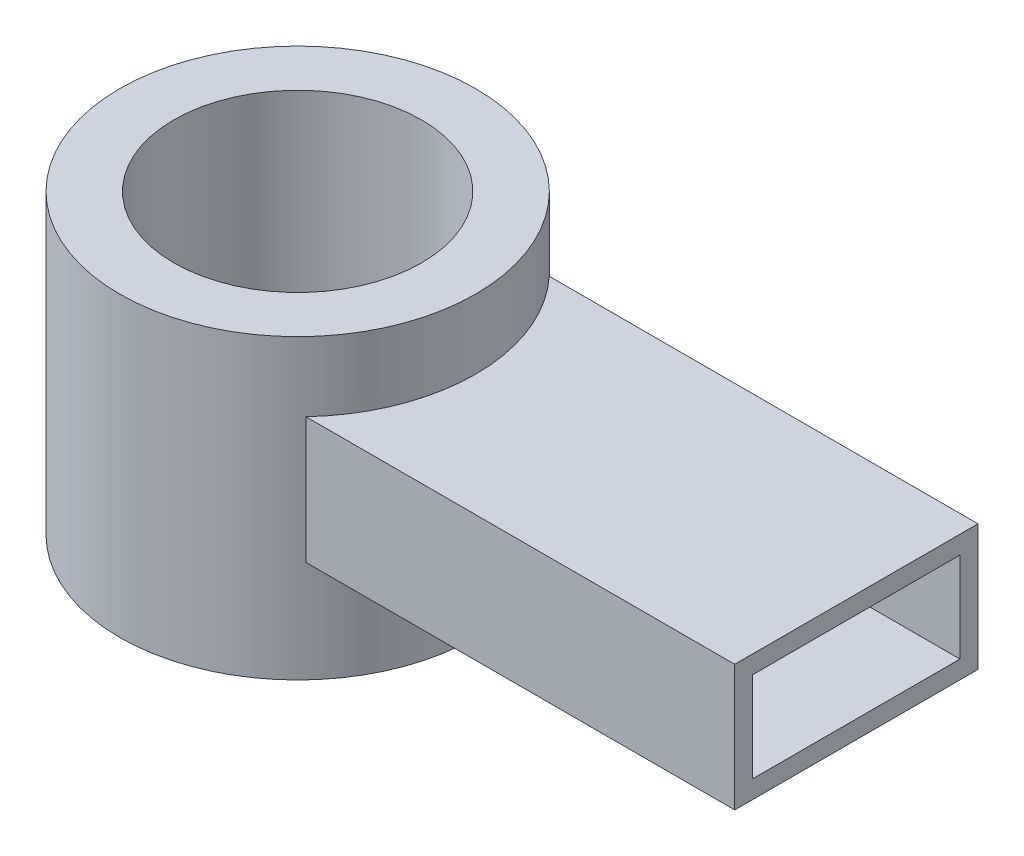
ISO-10303-21;
HEADER;
FILE_DESCRIPTION(('STEP AP214'),'2;1');
FILE_NAME('part.step','',(''),(''),'','','');
FILE_SCHEMA(('AUTOMOTIVE_DESIGN { 1 0 10303 214 1 1 1 1 }'));
ENDSEC;
DATA;
#1=APPLICATION_CONTEXT('core data for automotive mechanical design processes');
#2=APPLICATION_PROTOCOL_DEFINITION('international standard','automotive_design',2000,#1);
#3=PRODUCT_CONTEXT('',#1,'mechanical');
#4=PRODUCT('Part','Part','',(#3));
#5=PRODUCT_RELATED_PRODUCT_CATEGORY('part','',(#4));
#6=PRODUCT_DEFINITION_FORMATION('','',#4);
#7=PRODUCT_DEFINITION_CONTEXT('part definition',#1,'design');
#8=PRODUCT_DEFINITION('design','',#6,#7);
#9=PRODUCT_DEFINITION_SHAPE('','',#8);
#10=(LENGTH_UNIT() NAMED_UNIT(*) SI_UNIT(.MILLI.,.METRE.));
#11=(NAMED_UNIT(*) PLANE_ANGLE_UNIT() SI_UNIT($,.RADIAN.));
#12=(NAMED_UNIT(*) SI_UNIT($,.STERADIAN.) SOLID_ANGLE_UNIT());
#13=UNCERTAINTY_MEASURE_WITH_UNIT(LENGTH_MEASURE(1.E-05),#10,'distance_accuracy_value','');
#14=(GEOMETRIC_REPRESENTATION_CONTEXT(3) GLOBAL_UNCERTAINTY_ASSIGNED_CONTEXT((#13)) GLOBAL_UNIT_ASSIGNED_CONTEXT((#10,
#11,#12)) REPRESENTATION_CONTEXT('',''));
#15=CARTESIAN_POINT('',(0.,0.,0.));
#16=DIRECTION('',(0.,0.,1.));
#17=DIRECTION('',(1.,0.,0.));
#18=AXIS2_PLACEMENT_3D('',#15,#16,#17);
#19=CARTESIAN_POINT('',(0.,80.,0.));
#20=DIRECTION('',(0.,-1.,0.));
#21=DIRECTION('',(0.,0.,-1.));
#22=AXIS2_PLACEMENT_3D('',#19,#20,#21);
#23=CYLINDRICAL_SURFACE('',#22,19.75);
#24=DIRECTION('',(0.,-1.,0.));
#25=VECTOR('',#24,1.);
#26=CARTESIAN_POINT('',(14.4157032433354,80.,-13.5000000000033));
#27=LINE('',#26,#25);
#28=CARTESIAN_POINT('',(14.4157032433353,58.2992523189084,-13.5000000000034));
#29=VERTEX_POINT('',#28);
#30=CARTESIAN_POINT('',(14.4157032433354,72.2992523189084,-13.5000000000033));
#31=VERTEX_POINT('',#30);
#32=EDGE_CURVE('E12',#29,#31,#27,.F.);
#33=ORIENTED_EDGE('',*,*,#32,.F.);
#34=CARTESIAN_POINT('',(0.,58.2992523189084,0.));
#35=DIRECTION('',(0.,1.,0.));
#36=DIRECTION('',(0.,0.,1.));
#37=AXIS2_PLACEMENT_3D('',#34,#35,#36);
#38=CIRCLE('',#37,19.75);
#39=CARTESIAN_POINT('',(14.4157032433416,58.2992523189084,13.4999999999966));
#40=VERTEX_POINT('',#39);
#41=EDGE_CURVE('E188',#40,#29,#38,.T.);
#42=ORIENTED_EDGE('',*,*,#41,.F.);
#43=DIRECTION('',(0.,-1.,0.));
#44=VECTOR('',#43,1.);
#45=CARTESIAN_POINT('',(14.4157032433416,80.,13.4999999999966));
#46=LINE('',#45,#44);
#47=CARTESIAN_POINT('',(14.4157032433416,72.2992523189084,13.4999999999966));
#48=VERTEX_POINT('',#47);
#49=EDGE_CURVE('E52',#48,#40,#46,.T.);
#50=ORIENTED_EDGE('',*,*,#49,.F.);
#51=CARTESIAN_POINT('',(0.,72.2992523189084,0.));
#52=DIRECTION('',(0.,-1.,0.));
#53=DIRECTION('',(0.,0.,-1.));
#54=AXIS2_PLACEMENT_3D('',#51,#52,#53);
#55=CIRCLE('',#54,19.75);
#56=EDGE_CURVE('E67',#31,#48,#55,.T.);
#57=ORIENTED_EDGE('',*,*,#56,.F.);
#58=EDGE_LOOP('',(#33,#42,#50,#57));
#59=FACE_BOUND('',#58,.T.);
#60=CARTESIAN_POINT('',(0.,80.,0.));
#61=DIRECTION('',(0.,1.,0.));
#62=DIRECTION('',(1.,0.,0.));
#63=AXIS2_PLACEMENT_3D('',#60,#61,#62);
#64=CIRCLE('',#63,19.75);
#65=CARTESIAN_POINT('',(19.75,80.,0.));
#66=VERTEX_POINT('',#65);
#67=EDGE_CURVE('E195',#66,#66,#64,.T.);
#68=ORIENTED_EDGE('',*,*,#67,.F.);
#69=EDGE_LOOP('',(#68));
#70=FACE_BOUND('',#69,.T.);
#71=CARTESIAN_POINT('',(0.,47.,0.));
#72=DIRECTION('',(0.,-1.,0.));
#73=DIRECTION('',(1.,0.,0.));
#74=AXIS2_PLACEMENT_3D('',#71,#72,#73);
#75=CIRCLE('',#74,19.75);
#76=CARTESIAN_POINT('',(19.75,47.,0.));
#77=VERTEX_POINT('',#76);
#78=EDGE_CURVE('E146',#77,#77,#75,.T.);
#79=ORIENTED_EDGE('',*,*,#78,.F.);
#80=EDGE_LOOP('',(#79));
#81=FACE_BOUND('',#80,.T.);
#82=ADVANCED_FACE('F45',(#59,#70,#81),#23,.T.);
#83=CARTESIAN_POINT('',(0.,80.,0.));
#84=DIRECTION('',(0.,-1.,0.));
#85=DIRECTION('',(0.,0.,-1.));
#86=AXIS2_PLACEMENT_3D('',#83,#84,#85);
#87=CYLINDRICAL_SURFACE('',#86,13.75);
#88=CARTESIAN_POINT('',(0.,72.2992523189084,0.));
#89=DIRECTION('',(0.,-1.,0.));
#90=DIRECTION('',(0.,0.,-1.));
#91=AXIS2_PLACEMENT_3D('',#88,#89,#90);
#92=CIRCLE('',#91,13.75);
#93=CARTESIAN_POINT('',(10.,72.2992523189084,-9.43729304408843));
#94=VERTEX_POINT('',#93);
#95=CARTESIAN_POINT('',(10.,72.2992523189084,9.43729304408843));
#96=VERTEX_POINT('',#95);
#97=EDGE_CURVE('E204',#94,#96,#92,.T.);
#98=ORIENTED_EDGE('',*,*,#97,.T.);
#99=DIRECTION('',(0.,-1.,0.));
#100=VECTOR('',#99,1.);
#101=CARTESIAN_POINT('',(10.,80.,9.43729304408843));
#102=LINE('',#101,#100);
#103=CARTESIAN_POINT('',(10.,58.2992523189084,9.43729304408843));
#104=VERTEX_POINT('',#103);
#105=EDGE_CURVE('E207',#96,#104,#102,.T.);
#106=ORIENTED_EDGE('',*,*,#105,.T.);
#107=CARTESIAN_POINT('',(0.,58.2992523189084,0.));
#108=DIRECTION('',(0.,1.,0.));
#109=DIRECTION('',(0.,0.,1.));
#110=AXIS2_PLACEMENT_3D('',#107,#108,#109);
#111=CIRCLE('',#110,13.75);
#112=CARTESIAN_POINT('',(10.,58.2992523189084,-9.43729304408843));
#113=VERTEX_POINT('',#112);
#114=EDGE_CURVE('E201',#104,#113,#111,.T.);
#115=ORIENTED_EDGE('',*,*,#114,.T.);
#116=DIRECTION('',(0.,-1.,0.));
#117=VECTOR('',#116,1.);
#118=CARTESIAN_POINT('',(10.,80.,-9.43729304408843));
#119=LINE('',#118,#117);
#120=EDGE_CURVE('E198',#113,#94,#119,.F.);
#121=ORIENTED_EDGE('',*,*,#120,.T.);
#122=EDGE_LOOP('',(#98,#106,#115,#121));
#123=FACE_BOUND('',#122,.T.);
#124=CARTESIAN_POINT('',(0.,80.,0.));
#125=DIRECTION('',(0.,1.,0.));
#126=DIRECTION('',(0.,0.,1.));
#127=AXIS2_PLACEMENT_3D('',#124,#125,#126);
#128=CIRCLE('',#127,13.75);
#129=CARTESIAN_POINT('',(0.,80.,13.75));
#130=VERTEX_POINT('',#129);
#131=EDGE_CURVE('E192',#130,#130,#128,.T.);
#132=ORIENTED_EDGE('',*,*,#131,.T.);
#133=EDGE_LOOP('',(#132));
#134=FACE_BOUND('',#133,.T.);
#135=CARTESIAN_POINT('',(0.,47.,0.));
#136=DIRECTION('',(0.,-1.,0.));
#137=DIRECTION('',(0.,0.,-1.));
#138=AXIS2_PLACEMENT_3D('',#135,#136,#137);
#139=CIRCLE('',#138,13.75);
#140=CARTESIAN_POINT('',(0.,47.,-13.75));
#141=VERTEX_POINT('',#140);
#142=EDGE_CURVE('E235',#141,#141,#139,.T.);
#143=ORIENTED_EDGE('',*,*,#142,.T.);
#144=EDGE_LOOP('',(#143));
#145=FACE_BOUND('',#144,.T.);
#146=ADVANCED_FACE('F229',(#123,#134,#145),#87,.F.);
#147=CARTESIAN_POINT('',(0.,80.,0.));
#148=DIRECTION('',(0.,1.,0.));
#149=DIRECTION('',(0.,0.,1.));
#150=AXIS2_PLACEMENT_3D('',#147,#148,#149);
#151=PLANE('',#150);
#152=ORIENTED_EDGE('',*,*,#67,.T.);
#153=EDGE_LOOP('',(#152));
#154=FACE_BOUND('',#153,.T.);
#155=ORIENTED_EDGE('',*,*,#131,.F.);
#156=EDGE_LOOP('',(#155));
#157=FACE_BOUND('',#156,.T.);
#158=ADVANCED_FACE('F267',(#154,#157),#151,.T.);
#159=CARTESIAN_POINT('',(10.,0.,0.));
#160=DIRECTION('',(1.,0.,0.));
#161=DIRECTION('',(0.,0.,-1.));
#162=AXIS2_PLACEMENT_3D('',#159,#160,#161);
#163=PLANE('',#162);
#164=ORIENTED_EDGE('',*,*,#105,.F.);
#165=DIRECTION('',(0.,0.,1.));
#166=VECTOR('',#165,1.);
#167=CARTESIAN_POINT('',(10.,72.2992523189084,13.4999999999966));
#168=LINE('',#167,#166);
#169=EDGE_CURVE('E158',#94,#96,#168,.T.);
#170=ORIENTED_EDGE('',*,*,#169,.F.);
#171=ORIENTED_EDGE('',*,*,#120,.F.);
#172=DIRECTION('',(0.,0.,-1.));
#173=VECTOR('',#172,1.);
#174=CARTESIAN_POINT('',(10.,58.2992523189084,13.4999999999966));
#175=LINE('',#174,#173);
#176=EDGE_CURVE('E166',#104,#113,#175,.T.);
#177=ORIENTED_EDGE('',*,*,#176,.F.);
#178=EDGE_LOOP('',(#164,#170,#171,#177));
#179=FACE_BOUND('',#178,.T.);
#180=ADVANCED_FACE('F263',(#179),#163,.F.);
#181=CARTESIAN_POINT('',(62.,58.2992523189084,13.4999999999966));
#182=DIRECTION('',(0.,1.,0.));
#183=DIRECTION('',(0.,0.,1.));
#184=AXIS2_PLACEMENT_3D('',#181,#182,#183);
#185=PLANE('',#184);
#186=ORIENTED_EDGE('',*,*,#114,.F.);
#187=ORIENTED_EDGE('',*,*,#176,.T.);
#188=EDGE_LOOP('',(#186,#187));
#189=FACE_BOUND('',#188,.T.);
#190=ADVANCED_FACE('F266',(#189),#185,.F.);
#191=CARTESIAN_POINT('',(62.,72.2992523189084,13.4999999999966));
#192=DIRECTION('',(0.,-1.,0.));
#193=DIRECTION('',(0.,0.,-1.));
#194=AXIS2_PLACEMENT_3D('',#191,#192,#193);
#195=PLANE('',#194);
#196=ORIENTED_EDGE('',*,*,#97,.F.);
#197=ORIENTED_EDGE('',*,*,#169,.T.);
#198=EDGE_LOOP('',(#196,#197));
#199=FACE_BOUND('',#198,.T.);
#200=ADVANCED_FACE('F275',(#199),#195,.F.);
#201=CARTESIAN_POINT('',(62.,72.2992523189084,-13.5000000000034));
#202=DIRECTION('',(0.,0.,1.));
#203=DIRECTION('',(0.,-1.,0.));
#204=AXIS2_PLACEMENT_3D('',#201,#202,#203);
#205=PLANE('',#204);
#206=DIRECTION('',(-1.,0.,0.));
#207=VECTOR('',#206,1.);
#208=CARTESIAN_POINT('',(62.,58.2992523189084,-13.5000000000034));
#209=LINE('',#208,#207);
#210=CARTESIAN_POINT('',(62.,58.2992523189084,-13.5000000000034));
#211=VERTEX_POINT('',#210);
#212=EDGE_CURVE('E172',#211,#29,#209,.T.);
#213=ORIENTED_EDGE('',*,*,#212,.T.);
#214=ORIENTED_EDGE('',*,*,#32,.T.);
#215=DIRECTION('',(-1.,0.,0.));
#216=VECTOR('',#215,1.);
#217=CARTESIAN_POINT('',(62.,72.2992523189084,-13.5000000000034));
#218=LINE('',#217,#216);
#219=CARTESIAN_POINT('',(62.,72.2992523189084,-13.5000000000034));
#220=VERTEX_POINT('',#219);
#221=EDGE_CURVE('E185',#220,#31,#218,.T.);
#222=ORIENTED_EDGE('',*,*,#221,.F.);
#223=DIRECTION('',(0.,1.,0.));
#224=VECTOR('',#223,1.);
#225=CARTESIAN_POINT('',(62.,72.2992523189084,-13.5000000000034));
#226=LINE('',#225,#224);
#227=EDGE_CURVE('E162',#211,#220,#226,.T.);
#228=ORIENTED_EDGE('',*,*,#227,.F.);
#229=EDGE_LOOP('',(#213,#214,#222,#228));
#230=FACE_BOUND('',#229,.T.);
#231=ADVANCED_FACE('F226',(#230),#205,.F.);
#232=CARTESIAN_POINT('',(62.,72.2992523189084,13.4999999999966));
#233=DIRECTION('',(0.,0.,-1.));
#234=DIRECTION('',(-1.,0.,0.));
#235=AXIS2_PLACEMENT_3D('',#232,#233,#234);
#236=PLANE('',#235);
#237=DIRECTION('',(-1.,0.,0.));
#238=VECTOR('',#237,1.);
#239=CARTESIAN_POINT('',(62.,72.2992523189084,13.4999999999966));
#240=LINE('',#239,#238);
#241=CARTESIAN_POINT('',(62.,72.2992523189084,13.4999999999966));
#242=VERTEX_POINT('',#241);
#243=EDGE_CURVE('E182',#242,#48,#240,.T.);
#244=ORIENTED_EDGE('',*,*,#243,.T.);
#245=ORIENTED_EDGE('',*,*,#49,.T.);
#246=DIRECTION('',(-1.,0.,0.));
#247=VECTOR('',#246,1.);
#248=CARTESIAN_POINT('',(62.,58.2992523189084,13.4999999999966));
#249=LINE('',#248,#247);
#250=CARTESIAN_POINT('',(62.,58.2992523189084,13.4999999999966));
#251=VERTEX_POINT('',#250);
#252=EDGE_CURVE('E179',#251,#40,#249,.T.);
#253=ORIENTED_EDGE('',*,*,#252,.F.);
#254=DIRECTION('',(0.,-1.,0.));
#255=VECTOR('',#254,1.);
#256=CARTESIAN_POINT('',(62.,72.2992523189084,13.4999999999966));
#257=LINE('',#256,#255);
#258=EDGE_CURVE('E168',#242,#251,#257,.T.);
#259=ORIENTED_EDGE('',*,*,#258,.F.);
#260=EDGE_LOOP('',(#244,#245,#253,#259));
#261=FACE_BOUND('',#260,.T.);
#262=ADVANCED_FACE('F212',(#261),#236,.F.);
#263=ORIENTED_EDGE('',*,*,#221,.T.);
#264=ORIENTED_EDGE('',*,*,#56,.T.);
#265=ORIENTED_EDGE('',*,*,#243,.F.);
#266=DIRECTION('',(0.,0.,1.));
#267=VECTOR('',#266,1.);
#268=CARTESIAN_POINT('',(62.,72.2992523189084,13.4999999999966));
#269=LINE('',#268,#267);
#270=EDGE_CURVE('E165',#220,#242,#269,.T.);
#271=ORIENTED_EDGE('',*,*,#270,.F.);
#272=EDGE_LOOP('',(#263,#264,#265,#271));
#273=FACE_BOUND('',#272,.T.);
#274=ADVANCED_FACE('F224',(#273),#195,.F.);
#275=ORIENTED_EDGE('',*,*,#252,.T.);
#276=ORIENTED_EDGE('',*,*,#41,.T.);
#277=ORIENTED_EDGE('',*,*,#212,.F.);
#278=DIRECTION('',(0.,0.,-1.));
#279=VECTOR('',#278,1.);
#280=CARTESIAN_POINT('',(62.,58.2992523189084,13.4999999999966));
#281=LINE('',#280,#279);
#282=EDGE_CURVE('E170',#251,#211,#281,.T.);
#283=ORIENTED_EDGE('',*,*,#282,.F.);
#284=EDGE_LOOP('',(#275,#276,#277,#283));
#285=FACE_BOUND('',#284,.T.);
#286=ADVANCED_FACE('F217',(#285),#185,.F.);
#287=CARTESIAN_POINT('',(62.,0.,0.));
#288=DIRECTION('',(1.,0.,0.));
#289=DIRECTION('',(0.,0.,-1.));
#290=AXIS2_PLACEMENT_3D('',#287,#288,#289);
#291=PLANE('',#290);
#292=DIRECTION('',(0.,1.,0.));
#293=VECTOR('',#292,1.);
#294=CARTESIAN_POINT('',(62.,70.2992523189084,-11.5000000000034));
#295=LINE('',#294,#293);
#296=CARTESIAN_POINT('',(62.,60.2992523189084,-11.5000000000034));
#297=VERTEX_POINT('',#296);
#298=CARTESIAN_POINT('',(62.,70.2992523189084,-11.5000000000034));
#299=VERTEX_POINT('',#298);
#300=EDGE_CURVE('E59',#297,#299,#295,.T.);
#301=ORIENTED_EDGE('',*,*,#300,.F.);
#302=DIRECTION('',(0.,0.,-1.));
#303=VECTOR('',#302,1.);
#304=CARTESIAN_POINT('',(62.,60.2992523189084,11.4999999999966));
#305=LINE('',#304,#303);
#306=CARTESIAN_POINT('',(62.,60.2992523189084,11.4999999999966));
#307=VERTEX_POINT('',#306);
#308=EDGE_CURVE('E140',#307,#297,#305,.T.);
#309=ORIENTED_EDGE('',*,*,#308,.F.);
#310=DIRECTION('',(0.,-1.,0.));
#311=VECTOR('',#310,1.);
#312=CARTESIAN_POINT('',(62.,70.2992523189084,11.4999999999966));
#313=LINE('',#312,#311);
#314=CARTESIAN_POINT('',(62.,70.2992523189084,11.4999999999966));
#315=VERTEX_POINT('',#314);
#316=EDGE_CURVE('E143',#315,#307,#313,.T.);
#317=ORIENTED_EDGE('',*,*,#316,.F.);
#318=DIRECTION('',(0.,0.,1.));
#319=VECTOR('',#318,1.);
#320=CARTESIAN_POINT('',(62.,70.2992523189084,11.4999999999966));
#321=LINE('',#320,#319);
#322=EDGE_CURVE('E152',#299,#315,#321,.T.);
#323=ORIENTED_EDGE('',*,*,#322,.F.);
#324=EDGE_LOOP('',(#301,#309,#317,#323));
#325=FACE_BOUND('',#324,.T.);
#326=ORIENTED_EDGE('',*,*,#227,.T.);
#327=ORIENTED_EDGE('',*,*,#270,.T.);
#328=ORIENTED_EDGE('',*,*,#258,.T.);
#329=ORIENTED_EDGE('',*,*,#282,.T.);
#330=EDGE_LOOP('',(#326,#327,#328,#329));
#331=FACE_BOUND('',#330,.T.);
#332=ADVANCED_FACE('F221',(#325,#331),#291,.T.);
#333=CARTESIAN_POINT('',(12.,70.2992523189084,-11.5000000000034));
#334=DIRECTION('',(0.,0.,-1.));
#335=DIRECTION('',(-1.,0.,0.));
#336=AXIS2_PLACEMENT_3D('',#333,#334,#335);
#337=PLANE('',#336);
#338=ORIENTED_EDGE('',*,*,#300,.T.);
#339=DIRECTION('',(1.,0.,0.));
#340=VECTOR('',#339,1.);
#341=CARTESIAN_POINT('',(12.,70.2992523189084,-11.5000000000034));
#342=LINE('',#341,#340);
#343=CARTESIAN_POINT('',(12.,70.2992523189084,-11.5000000000034));
#344=VERTEX_POINT('',#343);
#345=EDGE_CURVE('E118',#344,#299,#342,.T.);
#346=ORIENTED_EDGE('',*,*,#345,.F.);
#347=DIRECTION('',(0.,1.,0.));
#348=VECTOR('',#347,1.);
#349=CARTESIAN_POINT('',(12.,70.2992523189084,-11.5000000000034));
#350=LINE('',#349,#348);
#351=CARTESIAN_POINT('',(12.,60.2992523189084,-11.5000000000034));
#352=VERTEX_POINT('',#351);
#353=EDGE_CURVE('E122',#352,#344,#350,.T.);
#354=ORIENTED_EDGE('',*,*,#353,.F.);
#355=DIRECTION('',(1.,0.,0.));
#356=VECTOR('',#355,1.);
#357=CARTESIAN_POINT('',(12.,60.2992523189084,-11.5000000000034));
#358=LINE('',#357,#356);
#359=EDGE_CURVE('E156',#352,#297,#358,.T.);
#360=ORIENTED_EDGE('',*,*,#359,.T.);
#361=EDGE_LOOP('',(#338,#346,#354,#360));
#362=FACE_BOUND('',#361,.T.);
#363=ADVANCED_FACE('F120',(#362),#337,.F.);
#364=CARTESIAN_POINT('',(12.,60.2992523189084,11.4999999999966));
#365=DIRECTION('',(0.,-1.,0.));
#366=DIRECTION('',(0.,0.,-1.));
#367=AXIS2_PLACEMENT_3D('',#364,#365,#366);
#368=PLANE('',#367);
#369=ORIENTED_EDGE('',*,*,#308,.T.);
#370=ORIENTED_EDGE('',*,*,#359,.F.);
#371=DIRECTION('',(0.,0.,-1.));
#372=VECTOR('',#371,1.);
#373=CARTESIAN_POINT('',(12.,60.2992523189084,11.4999999999966));
#374=LINE('',#373,#372);
#375=CARTESIAN_POINT('',(12.,60.2992523189084,11.4999999999966));
#376=VERTEX_POINT('',#375);
#377=EDGE_CURVE('E128',#376,#352,#374,.T.);
#378=ORIENTED_EDGE('',*,*,#377,.F.);
#379=DIRECTION('',(1.,0.,0.));
#380=VECTOR('',#379,1.);
#381=CARTESIAN_POINT('',(12.,60.2992523189084,11.4999999999966));
#382=LINE('',#381,#380);
#383=EDGE_CURVE('E159',#376,#307,#382,.T.);
#384=ORIENTED_EDGE('',*,*,#383,.T.);
#385=EDGE_LOOP('',(#369,#370,#378,#384));
#386=FACE_BOUND('',#385,.T.);
#387=ADVANCED_FACE('F248',(#386),#368,.F.);
#388=CARTESIAN_POINT('',(12.,70.2992523189084,11.4999999999966));
#389=DIRECTION('',(0.,0.,1.));
#390=DIRECTION('',(1.,0.,0.));
#391=AXIS2_PLACEMENT_3D('',#388,#389,#390);
#392=PLANE('',#391);
#393=ORIENTED_EDGE('',*,*,#316,.T.);
#394=ORIENTED_EDGE('',*,*,#383,.F.);
#395=DIRECTION('',(0.,-1.,0.));
#396=VECTOR('',#395,1.);
#397=CARTESIAN_POINT('',(12.,70.2992523189084,11.4999999999966));
#398=LINE('',#397,#396);
#399=CARTESIAN_POINT('',(12.,70.2992523189084,11.4999999999966));
#400=VERTEX_POINT('',#399);
#401=EDGE_CURVE('E136',#400,#376,#398,.T.);
#402=ORIENTED_EDGE('',*,*,#401,.F.);
#403=DIRECTION('',(1.,0.,0.));
#404=VECTOR('',#403,1.);
#405=CARTESIAN_POINT('',(12.,70.2992523189084,11.4999999999966));
#406=LINE('',#405,#404);
#407=EDGE_CURVE('E127',#400,#315,#406,.T.);
#408=ORIENTED_EDGE('',*,*,#407,.T.);
#409=EDGE_LOOP('',(#393,#394,#402,#408));
#410=FACE_BOUND('',#409,.T.);
#411=ADVANCED_FACE('F251',(#410),#392,.F.);
#412=CARTESIAN_POINT('',(12.,70.2992523189084,11.4999999999966));
#413=DIRECTION('',(0.,1.,0.));
#414=DIRECTION('',(0.,0.,1.));
#415=AXIS2_PLACEMENT_3D('',#412,#413,#414);
#416=PLANE('',#415);
#417=ORIENTED_EDGE('',*,*,#322,.T.);
#418=ORIENTED_EDGE('',*,*,#407,.F.);
#419=DIRECTION('',(0.,0.,1.));
#420=VECTOR('',#419,1.);
#421=CARTESIAN_POINT('',(12.,70.2992523189084,11.4999999999966));
#422=LINE('',#421,#420);
#423=EDGE_CURVE('E131',#344,#400,#422,.T.);
#424=ORIENTED_EDGE('',*,*,#423,.F.);
#425=ORIENTED_EDGE('',*,*,#345,.T.);
#426=EDGE_LOOP('',(#417,#418,#424,#425));
#427=FACE_BOUND('',#426,.T.);
#428=ADVANCED_FACE('F132',(#427),#416,.F.);
#429=CARTESIAN_POINT('',(12.,0.,0.));
#430=DIRECTION('',(1.,0.,0.));
#431=DIRECTION('',(0.,0.,-1.));
#432=AXIS2_PLACEMENT_3D('',#429,#430,#431);
#433=PLANE('',#432);
#434=ORIENTED_EDGE('',*,*,#353,.T.);
#435=ORIENTED_EDGE('',*,*,#423,.T.);
#436=ORIENTED_EDGE('',*,*,#401,.T.);
#437=ORIENTED_EDGE('',*,*,#377,.T.);
#438=EDGE_LOOP('',(#434,#435,#436,#437));
#439=FACE_BOUND('',#438,.T.);
#440=ADVANCED_FACE('F138',(#439),#433,.T.);
#441=CARTESIAN_POINT('',(0.,47.,0.));
#442=DIRECTION('',(0.,-1.,0.));
#443=DIRECTION('',(0.,0.,-1.));
#444=AXIS2_PLACEMENT_3D('',#441,#442,#443);
#445=PLANE('',#444);
#446=ORIENTED_EDGE('',*,*,#142,.F.);
#447=EDGE_LOOP('',(#446));
#448=FACE_BOUND('',#447,.T.);
#449=ORIENTED_EDGE('',*,*,#78,.T.);
#450=EDGE_LOOP('',(#449));
#451=FACE_BOUND('',#450,.T.);
#452=ADVANCED_FACE('F240',(#448,#451),#445,.T.);
#453=CLOSED_SHELL('',(#82,#146,#158,#180,#190,#200,#231,#262,#274,#286,#332,#363,#387,#411,#428,
#440,#452));
#454=MANIFOLD_SOLID_BREP('B2',#453);
#455=ADVANCED_BREP_SHAPE_REPRESENTATION('',(#18,#454),#14);
#456=SHAPE_DEFINITION_REPRESENTATION(#9,#455);
ENDSEC;
END-ISO-10303-21;
